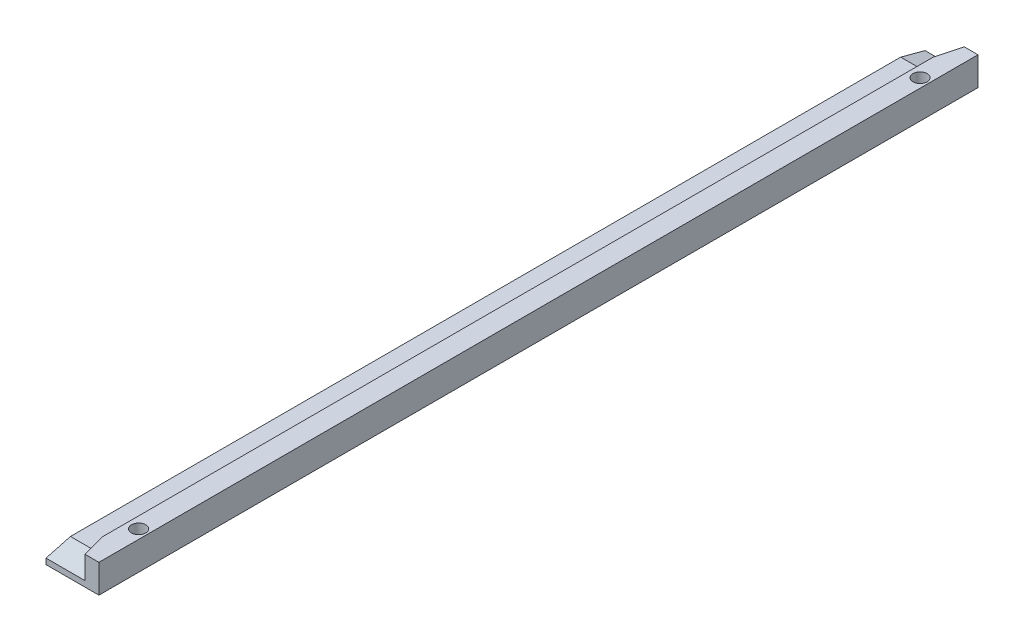
ISO-10303-21;
HEADER;
FILE_DESCRIPTION(('STEP AP214'),'2;1');
FILE_NAME('part.step','',(''),(''),'','','');
FILE_SCHEMA(('AUTOMOTIVE_DESIGN { 1 0 10303 214 1 1 1 1 }'));
ENDSEC;
DATA;
#1=APPLICATION_CONTEXT('core data for automotive mechanical design processes');
#2=APPLICATION_PROTOCOL_DEFINITION('international standard','automotive_design',2000,#1);
#3=PRODUCT_CONTEXT('',#1,'mechanical');
#4=PRODUCT('Part','Part','',(#3));
#5=PRODUCT_RELATED_PRODUCT_CATEGORY('part','',(#4));
#6=PRODUCT_DEFINITION_FORMATION('','',#4);
#7=PRODUCT_DEFINITION_CONTEXT('part definition',#1,'design');
#8=PRODUCT_DEFINITION('design','',#6,#7);
#9=PRODUCT_DEFINITION_SHAPE('','',#8);
#10=(LENGTH_UNIT() NAMED_UNIT(*) SI_UNIT(.MILLI.,.METRE.));
#11=(NAMED_UNIT(*) PLANE_ANGLE_UNIT() SI_UNIT($,.RADIAN.));
#12=(NAMED_UNIT(*) SI_UNIT($,.STERADIAN.) SOLID_ANGLE_UNIT());
#13=UNCERTAINTY_MEASURE_WITH_UNIT(LENGTH_MEASURE(1.E-05),#10,'distance_accuracy_value','');
#14=(GEOMETRIC_REPRESENTATION_CONTEXT(3) GLOBAL_UNCERTAINTY_ASSIGNED_CONTEXT((#13)) GLOBAL_UNIT_ASSIGNED_CONTEXT((#10,
#11,#12)) REPRESENTATION_CONTEXT('',''));
#15=CARTESIAN_POINT('',(0.,0.,0.));
#16=DIRECTION('',(0.,0.,1.));
#17=DIRECTION('',(1.,0.,0.));
#18=AXIS2_PLACEMENT_3D('',#15,#16,#17);
#19=CARTESIAN_POINT('',(-41.275,0.,-342.9));
#20=DIRECTION('',(0.,-1.,0.));
#21=DIRECTION('',(1.,0.,0.));
#22=AXIS2_PLACEMENT_3D('',#19,#20,#21);
#23=PLANE('',#22);
#24=CARTESIAN_POINT('',(-20.574,0.,264.272396));
#25=DIRECTION('',(0.,1.,0.));
#26=DIRECTION('',(0.,0.,1.));
#27=AXIS2_PLACEMENT_3D('',#24,#25,#26);
#28=CIRCLE('',#27,3.0734);
#29=CARTESIAN_POINT('',(-20.574,0.,267.345796));
#30=VERTEX_POINT('',#29);
#31=EDGE_CURVE('E373',#30,#30,#28,.T.);
#32=ORIENTED_EDGE('',*,*,#31,.T.);
#33=EDGE_LOOP('',(#32));
#34=FACE_BOUND('',#33,.T.);
#35=CARTESIAN_POINT('',(-20.574,0.,-264.272396));
#36=DIRECTION('',(0.,1.,0.));
#37=DIRECTION('',(0.,0.,1.));
#38=AXIS2_PLACEMENT_3D('',#35,#36,#37);
#39=CIRCLE('',#38,3.0734);
#40=CARTESIAN_POINT('',(-20.574,0.,-261.198996));
#41=VERTEX_POINT('',#40);
#42=EDGE_CURVE('E367',#41,#41,#39,.T.);
#43=ORIENTED_EDGE('',*,*,#42,.T.);
#44=EDGE_LOOP('',(#43));
#45=FACE_BOUND('',#44,.T.);
#46=CARTESIAN_POINT('',(-7.112,0.,304.8));
#47=DIRECTION('',(0.,1.,0.));
#48=DIRECTION('',(0.,0.,1.));
#49=AXIS2_PLACEMENT_3D('',#46,#47,#48);
#50=CIRCLE('',#49,3.3782);
#51=CARTESIAN_POINT('',(-7.112,0.,308.1782));
#52=VERTEX_POINT('',#51);
#53=EDGE_CURVE('E353',#52,#52,#50,.T.);
#54=ORIENTED_EDGE('',*,*,#53,.T.);
#55=EDGE_LOOP('',(#54));
#56=FACE_BOUND('',#55,.T.);
#57=CARTESIAN_POINT('',(-7.112,0.,-304.8));
#58=DIRECTION('',(0.,1.,0.));
#59=DIRECTION('',(0.,0.,1.));
#60=AXIS2_PLACEMENT_3D('',#57,#58,#59);
#61=CIRCLE('',#60,3.3782);
#62=CARTESIAN_POINT('',(-7.112,0.,-301.4218));
#63=VERTEX_POINT('',#62);
#64=EDGE_CURVE('E133',#63,#63,#61,.T.);
#65=ORIENTED_EDGE('',*,*,#64,.T.);
#66=EDGE_LOOP('',(#65));
#67=FACE_BOUND('',#66,.T.);
#68=DIRECTION('',(1.,0.,0.));
#69=VECTOR('',#68,1.);
#70=CARTESIAN_POINT('',(-41.275,0.,342.9));
#71=LINE('',#70,#69);
#72=CARTESIAN_POINT('',(-41.275,0.,342.9));
#73=VERTEX_POINT('',#72);
#74=CARTESIAN_POINT('',(0.,0.,342.9));
#75=VERTEX_POINT('',#74);
#76=EDGE_CURVE('E128',#73,#75,#71,.T.);
#77=ORIENTED_EDGE('',*,*,#76,.F.);
#78=DIRECTION('',(0.,0.,1.));
#79=VECTOR('',#78,1.);
#80=CARTESIAN_POINT('',(-41.275,0.,-342.9));
#81=LINE('',#80,#79);
#82=CARTESIAN_POINT('',(-41.275,0.,-342.9));
#83=VERTEX_POINT('',#82);
#84=EDGE_CURVE('E127',#83,#73,#81,.T.);
#85=ORIENTED_EDGE('',*,*,#84,.F.);
#86=DIRECTION('',(1.,0.,0.));
#87=VECTOR('',#86,1.);
#88=CARTESIAN_POINT('',(0.,0.,-342.9));
#89=LINE('',#88,#87);
#90=CARTESIAN_POINT('',(0.,0.,-342.9));
#91=VERTEX_POINT('',#90);
#92=EDGE_CURVE('E121',#83,#91,#89,.T.);
#93=ORIENTED_EDGE('',*,*,#92,.T.);
#94=DIRECTION('',(0.,0.,1.));
#95=VECTOR('',#94,1.);
#96=CARTESIAN_POINT('',(0.,0.,-342.9));
#97=LINE('',#96,#95);
#98=EDGE_CURVE('E106',#91,#75,#97,.T.);
#99=ORIENTED_EDGE('',*,*,#98,.T.);
#100=EDGE_LOOP('',(#77,#85,#93,#99));
#101=FACE_BOUND('',#100,.T.);
#102=ADVANCED_FACE('F33',(#34,#45,#56,#67,#101),#23,.T.);
#103=CARTESIAN_POINT('',(-41.275,9.52499999999999,-342.9));
#104=DIRECTION('',(-1.,0.,0.));
#105=DIRECTION('',(0.,0.,1.));
#106=AXIS2_PLACEMENT_3D('',#103,#104,#105);
#107=PLANE('',#106);
#108=DIRECTION('',(0.,0.,1.));
#109=VECTOR('',#108,1.);
#110=CARTESIAN_POINT('',(-41.275,9.52499999999999,-342.9));
#111=LINE('',#110,#109);
#112=CARTESIAN_POINT('',(-41.275,9.52499999999999,-323.85));
#113=VERTEX_POINT('',#112);
#114=CARTESIAN_POINT('',(-41.275,9.52499999999999,323.85));
#115=VERTEX_POINT('',#114);
#116=EDGE_CURVE('E146',#113,#115,#111,.T.);
#117=ORIENTED_EDGE('',*,*,#116,.F.);
#118=DIRECTION('',(0.,-0.258819045102519,-0.965925826289069));
#119=VECTOR('',#118,1.);
#120=CARTESIAN_POINT('',(-41.275,4.76249999999997,-341.623891971047));
#121=LINE('',#120,#119);
#122=CARTESIAN_POINT('',(-41.275,4.42056788418708,-342.9));
#123=VERTEX_POINT('',#122);
#124=EDGE_CURVE('E11',#113,#123,#121,.T.);
#125=ORIENTED_EDGE('',*,*,#124,.T.);
#126=DIRECTION('',(0.,-1.,0.));
#127=VECTOR('',#126,1.);
#128=CARTESIAN_POINT('',(-41.275,9.52499999999999,-342.9));
#129=LINE('',#128,#127);
#130=EDGE_CURVE('E116',#123,#83,#129,.T.);
#131=ORIENTED_EDGE('',*,*,#130,.T.);
#132=ORIENTED_EDGE('',*,*,#84,.T.);
#133=DIRECTION('',(0.,-1.,0.));
#134=VECTOR('',#133,1.);
#135=CARTESIAN_POINT('',(-41.275,9.52499999999999,342.9));
#136=LINE('',#135,#134);
#137=CARTESIAN_POINT('',(-41.275,4.42056788418708,342.9));
#138=VERTEX_POINT('',#137);
#139=EDGE_CURVE('E130',#138,#73,#136,.T.);
#140=ORIENTED_EDGE('',*,*,#139,.F.);
#141=DIRECTION('',(0.,-0.258819045102517,0.965925826289069));
#142=VECTOR('',#141,1.);
#143=CARTESIAN_POINT('',(-41.275,176.212499999998,-298.236218986638));
#144=LINE('',#143,#142);
#145=EDGE_CURVE('E157',#138,#115,#144,.F.);
#146=ORIENTED_EDGE('',*,*,#145,.T.);
#147=EDGE_LOOP('',(#117,#125,#131,#132,#140,#146));
#148=FACE_BOUND('',#147,.T.);
#149=ADVANCED_FACE('F193',(#148),#107,.T.);
#150=CARTESIAN_POINT('',(-41.275,9.52499999999999,-342.9));
#151=DIRECTION('',(0.,1.,0.));
#152=DIRECTION('',(-1.,0.,0.));
#153=AXIS2_PLACEMENT_3D('',#150,#151,#152);
#154=PLANE('',#153);
#155=CARTESIAN_POINT('',(-20.574,9.525,264.272396));
#156=DIRECTION('',(0.,1.,0.));
#157=DIRECTION('',(0.,0.,1.));
#158=AXIS2_PLACEMENT_3D('',#155,#156,#157);
#159=CIRCLE('',#158,3.0734);
#160=CARTESIAN_POINT('',(-20.574,9.525,267.345796));
#161=VERTEX_POINT('',#160);
#162=EDGE_CURVE('E375',#161,#161,#159,.T.);
#163=ORIENTED_EDGE('',*,*,#162,.F.);
#164=EDGE_LOOP('',(#163));
#165=FACE_BOUND('',#164,.T.);
#166=CARTESIAN_POINT('',(-20.574,9.525,-264.272396));
#167=DIRECTION('',(0.,1.,0.));
#168=DIRECTION('',(0.,0.,1.));
#169=AXIS2_PLACEMENT_3D('',#166,#167,#168);
#170=CIRCLE('',#169,3.0734);
#171=CARTESIAN_POINT('',(-20.574,9.525,-261.198996));
#172=VERTEX_POINT('',#171);
#173=EDGE_CURVE('E370',#172,#172,#170,.T.);
#174=ORIENTED_EDGE('',*,*,#173,.F.);
#175=EDGE_LOOP('',(#174));
#176=FACE_BOUND('',#175,.T.);
#177=DIRECTION('',(0.,0.,1.));
#178=VECTOR('',#177,1.);
#179=CARTESIAN_POINT('',(-15.875,9.52499999999999,-342.9));
#180=LINE('',#179,#178);
#181=CARTESIAN_POINT('',(-15.875,9.52499999999999,-323.85));
#182=VERTEX_POINT('',#181);
#183=CARTESIAN_POINT('',(-15.875,9.52499999999999,323.85));
#184=VERTEX_POINT('',#183);
#185=EDGE_CURVE('E148',#182,#184,#180,.T.);
#186=ORIENTED_EDGE('',*,*,#185,.F.);
#187=DIRECTION('',(-1.,0.,0.));
#188=VECTOR('',#187,1.);
#189=CARTESIAN_POINT('',(-41.275,9.52499999999999,-323.85));
#190=LINE('',#189,#188);
#191=EDGE_CURVE('E42',#182,#113,#190,.T.);
#192=ORIENTED_EDGE('',*,*,#191,.T.);
#193=ORIENTED_EDGE('',*,*,#116,.T.);
#194=DIRECTION('',(1.,0.,0.));
#195=VECTOR('',#194,1.);
#196=CARTESIAN_POINT('',(-41.275,9.52499999999999,323.85));
#197=LINE('',#196,#195);
#198=EDGE_CURVE('E160',#115,#184,#197,.T.);
#199=ORIENTED_EDGE('',*,*,#198,.T.);
#200=EDGE_LOOP('',(#186,#192,#193,#199));
#201=FACE_BOUND('',#200,.T.);
#202=ADVANCED_FACE('F196',(#165,#176,#201),#154,.T.);
#203=CARTESIAN_POINT('',(-15.875,9.52499999999999,-342.9));
#204=DIRECTION('',(-1.,0.,0.));
#205=DIRECTION('',(0.,0.,1.));
#206=AXIS2_PLACEMENT_3D('',#203,#204,#205);
#207=PLANE('',#206);
#208=DIRECTION('',(0.,0.,1.));
#209=VECTOR('',#208,1.);
#210=CARTESIAN_POINT('',(-15.875,22.225,-342.9));
#211=LINE('',#210,#209);
#212=CARTESIAN_POINT('',(-15.875,22.225,-323.85));
#213=VERTEX_POINT('',#212);
#214=CARTESIAN_POINT('',(-15.875,22.225,323.85));
#215=VERTEX_POINT('',#214);
#216=EDGE_CURVE('E150',#213,#215,#211,.T.);
#217=ORIENTED_EDGE('',*,*,#216,.F.);
#218=DIRECTION('',(0.,-1.,0.));
#219=VECTOR('',#218,1.);
#220=CARTESIAN_POINT('',(-15.875,9.52499999999999,-323.85));
#221=LINE('',#220,#219);
#222=EDGE_CURVE('E168',#213,#182,#221,.T.);
#223=ORIENTED_EDGE('',*,*,#222,.T.);
#224=ORIENTED_EDGE('',*,*,#185,.T.);
#225=DIRECTION('',(0.,1.,0.));
#226=VECTOR('',#225,1.);
#227=CARTESIAN_POINT('',(-15.875,9.52499999999999,323.85));
#228=LINE('',#227,#226);
#229=EDGE_CURVE('E163',#184,#215,#228,.T.);
#230=ORIENTED_EDGE('',*,*,#229,.T.);
#231=EDGE_LOOP('',(#217,#223,#224,#230));
#232=FACE_BOUND('',#231,.T.);
#233=ADVANCED_FACE('F185',(#232),#207,.T.);
#234=CARTESIAN_POINT('',(-15.875,22.225,-342.9));
#235=DIRECTION('',(0.,1.,0.));
#236=DIRECTION('',(0.,0.,1.));
#237=AXIS2_PLACEMENT_3D('',#234,#235,#236);
#238=PLANE('',#237);
#239=CARTESIAN_POINT('',(-7.112,22.225,304.8));
#240=DIRECTION('',(0.,1.,0.));
#241=DIRECTION('',(0.,0.,1.));
#242=AXIS2_PLACEMENT_3D('',#239,#240,#241);
#243=CIRCLE('',#242,5.55625);
#244=CARTESIAN_POINT('',(-7.112,22.225,310.35625));
#245=VERTEX_POINT('',#244);
#246=EDGE_CURVE('E364',#245,#245,#243,.T.);
#247=ORIENTED_EDGE('',*,*,#246,.F.);
#248=EDGE_LOOP('',(#247));
#249=FACE_BOUND('',#248,.T.);
#250=CARTESIAN_POINT('',(-7.112,22.225,-304.8));
#251=DIRECTION('',(0.,1.,0.));
#252=DIRECTION('',(0.,0.,1.));
#253=AXIS2_PLACEMENT_3D('',#250,#251,#252);
#254=CIRCLE('',#253,5.55625);
#255=CARTESIAN_POINT('',(-7.112,22.225,-299.24375));
#256=VERTEX_POINT('',#255);
#257=EDGE_CURVE('E350',#256,#256,#254,.T.);
#258=ORIENTED_EDGE('',*,*,#257,.F.);
#259=EDGE_LOOP('',(#258));
#260=FACE_BOUND('',#259,.T.);
#261=DIRECTION('',(-1.,0.,0.));
#262=VECTOR('',#261,1.);
#263=CARTESIAN_POINT('',(-15.875,22.225,-342.9));
#264=LINE('',#263,#262);
#265=CARTESIAN_POINT('',(0.,22.225,-342.9));
#266=VERTEX_POINT('',#265);
#267=CARTESIAN_POINT('',(-10.7705678841871,22.225,-342.9));
#268=VERTEX_POINT('',#267);
#269=EDGE_CURVE('E124',#266,#268,#264,.T.);
#270=ORIENTED_EDGE('',*,*,#269,.T.);
#271=DIRECTION('',(-0.258819045102519,0.,0.965925826289069));
#272=VECTOR('',#271,1.);
#273=CARTESIAN_POINT('',(-11.1125,22.225,-341.623891971047));
#274=LINE('',#273,#272);
#275=EDGE_CURVE('E176',#268,#213,#274,.T.);
#276=ORIENTED_EDGE('',*,*,#275,.T.);
#277=ORIENTED_EDGE('',*,*,#216,.T.);
#278=DIRECTION('',(-0.258819045102517,0.,-0.965925826289069));
#279=VECTOR('',#278,1.);
#280=CARTESIAN_POINT('',(-182.562499999998,22.225,-298.236218986638));
#281=LINE('',#280,#279);
#282=CARTESIAN_POINT('',(-10.7705678841871,22.225,342.9));
#283=VERTEX_POINT('',#282);
#284=EDGE_CURVE('E166',#215,#283,#281,.F.);
#285=ORIENTED_EDGE('',*,*,#284,.T.);
#286=DIRECTION('',(-1.,0.,0.));
#287=VECTOR('',#286,1.);
#288=CARTESIAN_POINT('',(-15.875,22.225,342.9));
#289=LINE('',#288,#287);
#290=CARTESIAN_POINT('',(0.,22.225,342.9));
#291=VERTEX_POINT('',#290);
#292=EDGE_CURVE('E139',#291,#283,#289,.T.);
#293=ORIENTED_EDGE('',*,*,#292,.F.);
#294=DIRECTION('',(0.,0.,1.));
#295=VECTOR('',#294,1.);
#296=CARTESIAN_POINT('',(0.,22.225,-342.9));
#297=LINE('',#296,#295);
#298=EDGE_CURVE('E115',#266,#291,#297,.T.);
#299=ORIENTED_EDGE('',*,*,#298,.F.);
#300=EDGE_LOOP('',(#270,#276,#277,#285,#293,#299));
#301=FACE_BOUND('',#300,.T.);
#302=ADVANCED_FACE('F181',(#249,#260,#301),#238,.T.);
#303=CARTESIAN_POINT('',(0.,0.,-342.9));
#304=DIRECTION('',(1.,0.,0.));
#305=DIRECTION('',(0.,0.,-1.));
#306=AXIS2_PLACEMENT_3D('',#303,#304,#305);
#307=PLANE('',#306);
#308=DIRECTION('',(0.,1.,0.));
#309=VECTOR('',#308,1.);
#310=CARTESIAN_POINT('',(0.,0.,342.9));
#311=LINE('',#310,#309);
#312=EDGE_CURVE('E111',#75,#291,#311,.T.);
#313=ORIENTED_EDGE('',*,*,#312,.F.);
#314=ORIENTED_EDGE('',*,*,#98,.F.);
#315=DIRECTION('',(0.,1.,0.));
#316=VECTOR('',#315,1.);
#317=CARTESIAN_POINT('',(0.,0.,-342.9));
#318=LINE('',#317,#316);
#319=EDGE_CURVE('E109',#91,#266,#318,.T.);
#320=ORIENTED_EDGE('',*,*,#319,.T.);
#321=ORIENTED_EDGE('',*,*,#298,.T.);
#322=EDGE_LOOP('',(#313,#314,#320,#321));
#323=FACE_BOUND('',#322,.T.);
#324=ADVANCED_FACE('F108',(#323),#307,.T.);
#325=CARTESIAN_POINT('',(-41.275,0.,-342.9));
#326=DIRECTION('',(0.,0.,1.));
#327=DIRECTION('',(1.,0.,0.));
#328=AXIS2_PLACEMENT_3D('',#325,#326,#327);
#329=PLANE('',#328);
#330=DIRECTION('',(1.,0.,0.));
#331=VECTOR('',#330,1.);
#332=CARTESIAN_POINT('',(-15.875,4.42056788418709,-342.9));
#333=LINE('',#332,#331);
#334=CARTESIAN_POINT('',(-10.7705678841871,4.42056788418709,-342.9));
#335=VERTEX_POINT('',#334);
#336=EDGE_CURVE('E56',#123,#335,#333,.T.);
#337=ORIENTED_EDGE('',*,*,#336,.T.);
#338=DIRECTION('',(0.,1.,0.));
#339=VECTOR('',#338,1.);
#340=CARTESIAN_POINT('',(-10.7705678841871,22.225,-342.9));
#341=LINE('',#340,#339);
#342=EDGE_CURVE('E174',#335,#268,#341,.T.);
#343=ORIENTED_EDGE('',*,*,#342,.T.);
#344=ORIENTED_EDGE('',*,*,#269,.F.);
#345=ORIENTED_EDGE('',*,*,#319,.F.);
#346=ORIENTED_EDGE('',*,*,#92,.F.);
#347=ORIENTED_EDGE('',*,*,#130,.F.);
#348=EDGE_LOOP('',(#337,#343,#344,#345,#346,#347));
#349=FACE_BOUND('',#348,.T.);
#350=ADVANCED_FACE('F120',(#349),#329,.F.);
#351=CARTESIAN_POINT('',(-41.275,0.,342.9));
#352=DIRECTION('',(0.,0.,1.));
#353=DIRECTION('',(1.,0.,0.));
#354=AXIS2_PLACEMENT_3D('',#351,#352,#353);
#355=PLANE('',#354);
#356=DIRECTION('',(0.,-1.,0.));
#357=VECTOR('',#356,1.);
#358=CARTESIAN_POINT('',(-10.7705678841871,0.,342.9));
#359=LINE('',#358,#357);
#360=CARTESIAN_POINT('',(-10.7705678841871,4.42056788418711,342.9));
#361=VERTEX_POINT('',#360);
#362=EDGE_CURVE('E145',#283,#361,#359,.T.);
#363=ORIENTED_EDGE('',*,*,#362,.T.);
#364=DIRECTION('',(-1.,0.,0.));
#365=VECTOR('',#364,1.);
#366=CARTESIAN_POINT('',(-41.275,4.42056788418711,342.9));
#367=LINE('',#366,#365);
#368=EDGE_CURVE('E154',#361,#138,#367,.T.);
#369=ORIENTED_EDGE('',*,*,#368,.T.);
#370=ORIENTED_EDGE('',*,*,#139,.T.);
#371=ORIENTED_EDGE('',*,*,#76,.T.);
#372=ORIENTED_EDGE('',*,*,#312,.T.);
#373=ORIENTED_EDGE('',*,*,#292,.T.);
#374=EDGE_LOOP('',(#363,#369,#370,#371,#372,#373));
#375=FACE_BOUND('',#374,.T.);
#376=ADVANCED_FACE('F205',(#375),#355,.T.);
#377=CARTESIAN_POINT('',(-10.7705678841871,0.,342.9));
#378=DIRECTION('',(0.965925826289069,0.,-0.258819045102517));
#379=DIRECTION('',(-0.258819045102517,0.,-0.965925826289069));
#380=AXIS2_PLACEMENT_3D('',#377,#378,#379);
#381=PLANE('',#380);
#382=ORIENTED_EDGE('',*,*,#284,.F.);
#383=ORIENTED_EDGE('',*,*,#229,.F.);
#384=DIRECTION('',(0.250562807085729,-0.250562807085728,0.935113126531031));
#385=VECTOR('',#384,1.);
#386=CARTESIAN_POINT('',(-12.6856886090301,6.33568860903013,335.752672152258));
#387=LINE('',#386,#385);
#388=EDGE_CURVE('E140',#361,#184,#387,.F.);
#389=ORIENTED_EDGE('',*,*,#388,.F.);
#390=ORIENTED_EDGE('',*,*,#362,.F.);
#391=EDGE_LOOP('',(#382,#383,#389,#390));
#392=FACE_BOUND('',#391,.T.);
#393=ADVANCED_FACE('F200',(#392),#381,.F.);
#394=CARTESIAN_POINT('',(-41.275,4.42056788418711,342.9));
#395=DIRECTION('',(0.,-0.965925826289069,-0.258819045102517));
#396=DIRECTION('',(0.,0.258819045102517,-0.965925826289069));
#397=AXIS2_PLACEMENT_3D('',#394,#395,#396);
#398=PLANE('',#397);
#399=ORIENTED_EDGE('',*,*,#388,.T.);
#400=ORIENTED_EDGE('',*,*,#198,.F.);
#401=ORIENTED_EDGE('',*,*,#145,.F.);
#402=ORIENTED_EDGE('',*,*,#368,.F.);
#403=EDGE_LOOP('',(#399,#400,#401,#402));
#404=FACE_BOUND('',#403,.T.);
#405=ADVANCED_FACE('F203',(#404),#398,.F.);
#406=CARTESIAN_POINT('',(-41.275,9.52499999999999,-323.85));
#407=DIRECTION('',(0.,0.965925826289069,-0.258819045102519));
#408=DIRECTION('',(0.,0.258819045102519,0.965925826289069));
#409=AXIS2_PLACEMENT_3D('',#406,#407,#408);
#410=PLANE('',#409);
#411=ORIENTED_EDGE('',*,*,#124,.F.);
#412=ORIENTED_EDGE('',*,*,#191,.F.);
#413=DIRECTION('',(0.25056280708573,-0.25056280708573,-0.93511312653103));
#414=VECTOR('',#413,1.);
#415=CARTESIAN_POINT('',(-15.875,9.52499999999999,-323.85));
#416=LINE('',#415,#414);
#417=EDGE_CURVE('E37',#335,#182,#416,.F.);
#418=ORIENTED_EDGE('',*,*,#417,.F.);
#419=ORIENTED_EDGE('',*,*,#336,.F.);
#420=EDGE_LOOP('',(#411,#412,#418,#419));
#421=FACE_BOUND('',#420,.T.);
#422=ADVANCED_FACE('F35',(#421),#410,.T.);
#423=CARTESIAN_POINT('',(-15.875,9.52499999999999,-323.85));
#424=DIRECTION('',(-0.965925826289069,0.,-0.258819045102519));
#425=DIRECTION('',(-0.258819045102519,0.,0.965925826289069));
#426=AXIS2_PLACEMENT_3D('',#423,#424,#425);
#427=PLANE('',#426);
#428=ORIENTED_EDGE('',*,*,#275,.F.);
#429=ORIENTED_EDGE('',*,*,#342,.F.);
#430=ORIENTED_EDGE('',*,*,#417,.T.);
#431=ORIENTED_EDGE('',*,*,#222,.F.);
#432=EDGE_LOOP('',(#428,#429,#430,#431));
#433=FACE_BOUND('',#432,.T.);
#434=ADVANCED_FACE('F188',(#433),#427,.T.);
#435=CARTESIAN_POINT('',(-7.112,22.225,-304.8));
#436=DIRECTION('',(0.,1.,0.));
#437=DIRECTION('',(0.,0.,1.));
#438=AXIS2_PLACEMENT_3D('',#435,#436,#437);
#439=CYLINDRICAL_SURFACE('',#438,3.3782);
#440=ORIENTED_EDGE('',*,*,#64,.F.);
#441=EDGE_LOOP('',(#440));
#442=FACE_BOUND('',#441,.T.);
#443=CARTESIAN_POINT('',(-7.112,5.715,-304.8));
#444=DIRECTION('',(0.,1.,0.));
#445=DIRECTION('',(0.,0.,1.));
#446=AXIS2_PLACEMENT_3D('',#443,#444,#445);
#447=CIRCLE('',#446,3.3782);
#448=CARTESIAN_POINT('',(-7.112,5.715,-301.4218));
#449=VERTEX_POINT('',#448);
#450=EDGE_CURVE('E346',#449,#449,#447,.T.);
#451=ORIENTED_EDGE('',*,*,#450,.T.);
#452=EDGE_LOOP('',(#451));
#453=FACE_BOUND('',#452,.T.);
#454=ADVANCED_FACE('F237',(#442,#453),#439,.F.);
#455=CARTESIAN_POINT('',(-3.7338,5.715,-304.8));
#456=DIRECTION('',(0.,-1.,0.));
#457=DIRECTION('',(0.,0.,-1.));
#458=AXIS2_PLACEMENT_3D('',#455,#456,#457);
#459=PLANE('',#458);
#460=ORIENTED_EDGE('',*,*,#450,.F.);
#461=EDGE_LOOP('',(#460));
#462=FACE_BOUND('',#461,.T.);
#463=CARTESIAN_POINT('',(-7.112,5.715,-304.8));
#464=DIRECTION('',(0.,1.,0.));
#465=DIRECTION('',(0.,0.,1.));
#466=AXIS2_PLACEMENT_3D('',#463,#464,#465);
#467=CIRCLE('',#466,5.55625);
#468=CARTESIAN_POINT('',(-7.112,5.715,-299.24375));
#469=VERTEX_POINT('',#468);
#470=EDGE_CURVE('E349',#469,#469,#467,.T.);
#471=ORIENTED_EDGE('',*,*,#470,.T.);
#472=EDGE_LOOP('',(#471));
#473=FACE_BOUND('',#472,.T.);
#474=ADVANCED_FACE('F242',(#462,#473),#459,.F.);
#475=CARTESIAN_POINT('',(-7.112,22.225,-304.8));
#476=DIRECTION('',(0.,1.,0.));
#477=DIRECTION('',(0.,0.,1.));
#478=AXIS2_PLACEMENT_3D('',#475,#476,#477);
#479=CYLINDRICAL_SURFACE('',#478,5.55625);
#480=ORIENTED_EDGE('',*,*,#470,.F.);
#481=EDGE_LOOP('',(#480));
#482=FACE_BOUND('',#481,.T.);
#483=ORIENTED_EDGE('',*,*,#257,.T.);
#484=EDGE_LOOP('',(#483));
#485=FACE_BOUND('',#484,.T.);
#486=ADVANCED_FACE('F334',(#482,#485),#479,.F.);
#487=CARTESIAN_POINT('',(-7.112,22.225,304.8));
#488=DIRECTION('',(0.,1.,0.));
#489=DIRECTION('',(0.,0.,1.));
#490=AXIS2_PLACEMENT_3D('',#487,#488,#489);
#491=CYLINDRICAL_SURFACE('',#490,3.3782);
#492=ORIENTED_EDGE('',*,*,#53,.F.);
#493=EDGE_LOOP('',(#492));
#494=FACE_BOUND('',#493,.T.);
#495=CARTESIAN_POINT('',(-7.112,5.715,304.8));
#496=DIRECTION('',(0.,1.,0.));
#497=DIRECTION('',(0.,0.,1.));
#498=AXIS2_PLACEMENT_3D('',#495,#496,#497);
#499=CIRCLE('',#498,3.3782);
#500=CARTESIAN_POINT('',(-7.112,5.715,308.1782));
#501=VERTEX_POINT('',#500);
#502=EDGE_CURVE('E358',#501,#501,#499,.T.);
#503=ORIENTED_EDGE('',*,*,#502,.T.);
#504=EDGE_LOOP('',(#503));
#505=FACE_BOUND('',#504,.T.);
#506=ADVANCED_FACE('F330',(#494,#505),#491,.F.);
#507=CARTESIAN_POINT('',(-3.7338,5.715,304.8));
#508=DIRECTION('',(0.,-1.,0.));
#509=DIRECTION('',(0.,0.,-1.));
#510=AXIS2_PLACEMENT_3D('',#507,#508,#509);
#511=PLANE('',#510);
#512=ORIENTED_EDGE('',*,*,#502,.F.);
#513=EDGE_LOOP('',(#512));
#514=FACE_BOUND('',#513,.T.);
#515=CARTESIAN_POINT('',(-7.112,5.715,304.8));
#516=DIRECTION('',(0.,1.,0.));
#517=DIRECTION('',(0.,0.,1.));
#518=AXIS2_PLACEMENT_3D('',#515,#516,#517);
#519=CIRCLE('',#518,5.55625);
#520=CARTESIAN_POINT('',(-7.112,5.715,310.35625));
#521=VERTEX_POINT('',#520);
#522=EDGE_CURVE('E361',#521,#521,#519,.T.);
#523=ORIENTED_EDGE('',*,*,#522,.T.);
#524=EDGE_LOOP('',(#523));
#525=FACE_BOUND('',#524,.T.);
#526=ADVANCED_FACE('F326',(#514,#525),#511,.F.);
#527=CARTESIAN_POINT('',(-7.112,22.225,304.8));
#528=DIRECTION('',(0.,1.,0.));
#529=DIRECTION('',(0.,0.,1.));
#530=AXIS2_PLACEMENT_3D('',#527,#528,#529);
#531=CYLINDRICAL_SURFACE('',#530,5.55625);
#532=ORIENTED_EDGE('',*,*,#522,.F.);
#533=EDGE_LOOP('',(#532));
#534=FACE_BOUND('',#533,.T.);
#535=ORIENTED_EDGE('',*,*,#246,.T.);
#536=EDGE_LOOP('',(#535));
#537=FACE_BOUND('',#536,.T.);
#538=ADVANCED_FACE('F306',(#534,#537),#531,.F.);
#539=CARTESIAN_POINT('',(-20.574,9.525,-264.272396));
#540=DIRECTION('',(0.,1.,0.));
#541=DIRECTION('',(0.,0.,1.));
#542=AXIS2_PLACEMENT_3D('',#539,#540,#541);
#543=CYLINDRICAL_SURFACE('',#542,3.0734);
#544=ORIENTED_EDGE('',*,*,#42,.F.);
#545=EDGE_LOOP('',(#544));
#546=FACE_BOUND('',#545,.T.);
#547=ORIENTED_EDGE('',*,*,#173,.T.);
#548=EDGE_LOOP('',(#547));
#549=FACE_BOUND('',#548,.T.);
#550=ADVANCED_FACE('F300',(#546,#549),#543,.F.);
#551=CARTESIAN_POINT('',(-20.574,9.525,264.272396));
#552=DIRECTION('',(0.,1.,0.));
#553=DIRECTION('',(0.,0.,1.));
#554=AXIS2_PLACEMENT_3D('',#551,#552,#553);
#555=CYLINDRICAL_SURFACE('',#554,3.0734);
#556=ORIENTED_EDGE('',*,*,#31,.F.);
#557=EDGE_LOOP('',(#556));
#558=FACE_BOUND('',#557,.T.);
#559=ORIENTED_EDGE('',*,*,#162,.T.);
#560=EDGE_LOOP('',(#559));
#561=FACE_BOUND('',#560,.T.);
#562=ADVANCED_FACE('F305',(#558,#561),#555,.F.);
#563=CLOSED_SHELL('',(#102,#149,#202,#233,#302,#324,#350,#376,#393,#405,#422,#434,#454,#474,
#486,#506,#526,#538,#550,#562));
#564=MANIFOLD_SOLID_BREP('B2',#563);
#565=ADVANCED_BREP_SHAPE_REPRESENTATION('',(#18,#564),#14);
#566=SHAPE_DEFINITION_REPRESENTATION(#9,#565);
ENDSEC;
END-ISO-10303-21;
